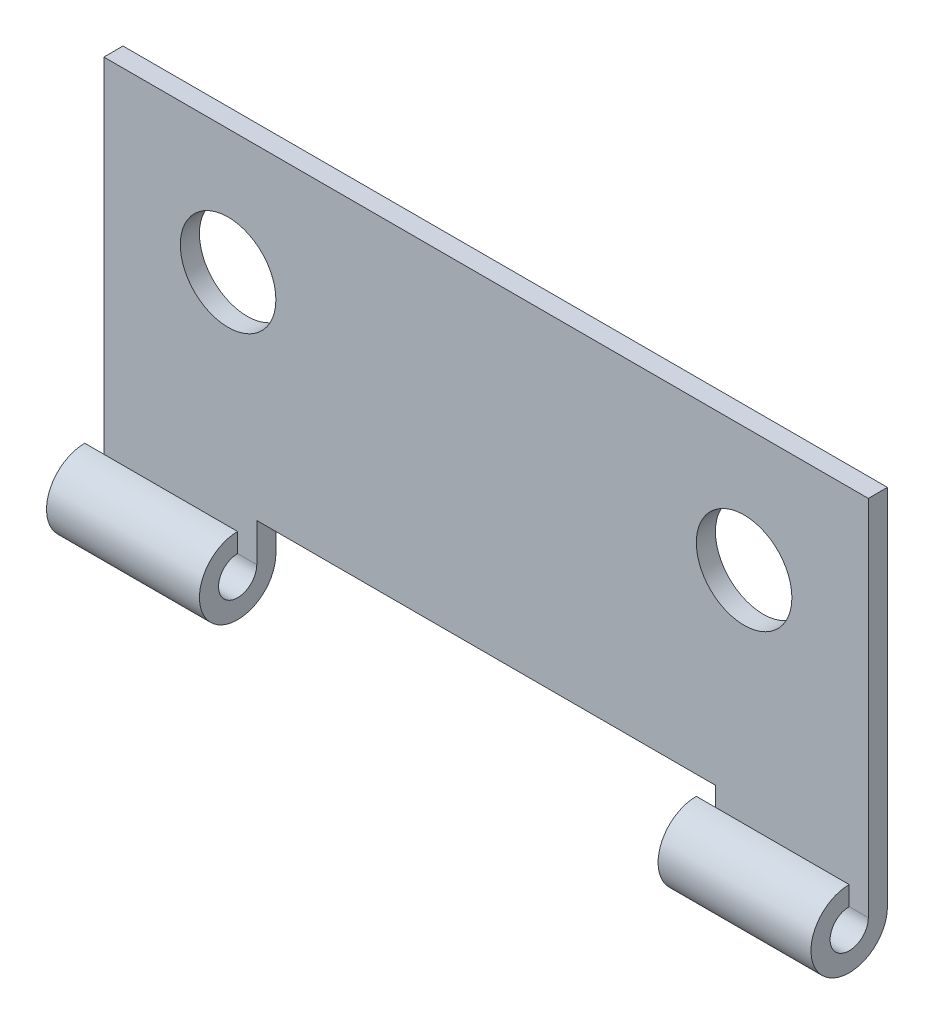
ISO-10303-21;
HEADER;
FILE_DESCRIPTION(('STEP AP214'),'2;1');
FILE_NAME('part.step','',(''),(''),'','','');
FILE_SCHEMA(('AUTOMOTIVE_DESIGN { 1 0 10303 214 1 1 1 1 }'));
ENDSEC;
DATA;
#1=APPLICATION_CONTEXT('core data for automotive mechanical design processes');
#2=APPLICATION_PROTOCOL_DEFINITION('international standard','automotive_design',2000,#1);
#3=PRODUCT_CONTEXT('',#1,'mechanical');
#4=PRODUCT('Part','Part','',(#3));
#5=PRODUCT_RELATED_PRODUCT_CATEGORY('part','',(#4));
#6=PRODUCT_DEFINITION_FORMATION('','',#4);
#7=PRODUCT_DEFINITION_CONTEXT('part definition',#1,'design');
#8=PRODUCT_DEFINITION('design','',#6,#7);
#9=PRODUCT_DEFINITION_SHAPE('','',#8);
#10=(LENGTH_UNIT() NAMED_UNIT(*) SI_UNIT(.MILLI.,.METRE.));
#11=(NAMED_UNIT(*) PLANE_ANGLE_UNIT() SI_UNIT($,.RADIAN.));
#12=(NAMED_UNIT(*) SI_UNIT($,.STERADIAN.) SOLID_ANGLE_UNIT());
#13=UNCERTAINTY_MEASURE_WITH_UNIT(LENGTH_MEASURE(1.E-05),#10,'distance_accuracy_value','');
#14=(GEOMETRIC_REPRESENTATION_CONTEXT(3) GLOBAL_UNCERTAINTY_ASSIGNED_CONTEXT((#13)) GLOBAL_UNIT_ASSIGNED_CONTEXT((#10,
#11,#12)) REPRESENTATION_CONTEXT('',''));
#15=CARTESIAN_POINT('',(0.,0.,0.));
#16=DIRECTION('',(0.,0.,1.));
#17=DIRECTION('',(1.,0.,0.));
#18=AXIS2_PLACEMENT_3D('',#15,#16,#17);
#19=CARTESIAN_POINT('',(0.,0.,1.));
#20=DIRECTION('',(1.,0.,0.));
#21=DIRECTION('',(0.,0.,-1.));
#22=AXIS2_PLACEMENT_3D('',#19,#20,#21);
#23=PLANE('',#22);
#24=DIRECTION('',(0.,-1.,0.));
#25=VECTOR('',#24,1.);
#26=CARTESIAN_POINT('',(0.,0.,0.));
#27=LINE('',#26,#25);
#28=CARTESIAN_POINT('',(0.,17.,0.));
#29=VERTEX_POINT('',#28);
#30=CARTESIAN_POINT('',(0.,-2.,0.));
#31=VERTEX_POINT('',#30);
#32=EDGE_CURVE('E203',#29,#31,#27,.T.);
#33=ORIENTED_EDGE('',*,*,#32,.T.);
#34=CARTESIAN_POINT('',(0.,-2.,2.));
#35=DIRECTION('',(-1.,0.,0.));
#36=DIRECTION('',(0.,0.,1.));
#37=AXIS2_PLACEMENT_3D('',#34,#35,#36);
#38=CIRCLE('',#37,2.);
#39=CARTESIAN_POINT('',(0.,0.,2.));
#40=VERTEX_POINT('',#39);
#41=EDGE_CURVE('E168',#31,#40,#38,.T.);
#42=ORIENTED_EDGE('',*,*,#41,.T.);
#43=DIRECTION('',(0.,-1.,0.));
#44=VECTOR('',#43,1.);
#45=CARTESIAN_POINT('',(0.,0.,2.));
#46=LINE('',#45,#44);
#47=CARTESIAN_POINT('',(0.,-1.,2.));
#48=VERTEX_POINT('',#47);
#49=EDGE_CURVE('E170',#40,#48,#46,.T.);
#50=ORIENTED_EDGE('',*,*,#49,.T.);
#51=CARTESIAN_POINT('',(0.,-2.,2.));
#52=DIRECTION('',(1.,0.,0.));
#53=DIRECTION('',(0.,0.,-1.));
#54=AXIS2_PLACEMENT_3D('',#51,#52,#53);
#55=CIRCLE('',#54,1.);
#56=CARTESIAN_POINT('',(0.,-2.,1.));
#57=VERTEX_POINT('',#56);
#58=EDGE_CURVE('E173',#48,#57,#55,.T.);
#59=ORIENTED_EDGE('',*,*,#58,.T.);
#60=DIRECTION('',(0.,-1.,0.));
#61=VECTOR('',#60,1.);
#62=CARTESIAN_POINT('',(0.,0.,1.));
#63=LINE('',#62,#61);
#64=CARTESIAN_POINT('',(0.,17.,1.));
#65=VERTEX_POINT('',#64);
#66=EDGE_CURVE('E212',#65,#57,#63,.T.);
#67=ORIENTED_EDGE('',*,*,#66,.F.);
#68=DIRECTION('',(0.,0.,-1.));
#69=VECTOR('',#68,1.);
#70=CARTESIAN_POINT('',(0.,17.,1.));
#71=LINE('',#70,#69);
#72=EDGE_CURVE('E40',#65,#29,#71,.T.);
#73=ORIENTED_EDGE('',*,*,#72,.T.);
#74=EDGE_LOOP('',(#33,#42,#50,#59,#67,#73));
#75=FACE_BOUND('',#74,.T.);
#76=ADVANCED_FACE('F33',(#75),#23,.F.);
#77=CARTESIAN_POINT('',(0.,0.,1.));
#78=DIRECTION('',(0.,1.,0.));
#79=DIRECTION('',(0.,0.,1.));
#80=AXIS2_PLACEMENT_3D('',#77,#78,#79);
#81=PLANE('',#80);
#82=DIRECTION('',(1.,0.,0.));
#83=VECTOR('',#82,1.);
#84=CARTESIAN_POINT('',(0.,0.,0.));
#85=LINE('',#84,#83);
#86=CARTESIAN_POINT('',(8.,0.,0.));
#87=VERTEX_POINT('',#86);
#88=CARTESIAN_POINT('',(32.,0.,0.));
#89=VERTEX_POINT('',#88);
#90=EDGE_CURVE('E52',#87,#89,#85,.T.);
#91=ORIENTED_EDGE('',*,*,#90,.T.);
#92=DIRECTION('',(0.,0.,-1.));
#93=VECTOR('',#92,1.);
#94=CARTESIAN_POINT('',(32.,0.,0.));
#95=LINE('',#94,#93);
#96=CARTESIAN_POINT('',(32.,0.,1.));
#97=VERTEX_POINT('',#96);
#98=EDGE_CURVE('E47',#97,#89,#95,.T.);
#99=ORIENTED_EDGE('',*,*,#98,.F.);
#100=DIRECTION('',(1.,0.,0.));
#101=VECTOR('',#100,1.);
#102=CARTESIAN_POINT('',(0.,0.,1.));
#103=LINE('',#102,#101);
#104=CARTESIAN_POINT('',(8.,0.,1.));
#105=VERTEX_POINT('',#104);
#106=EDGE_CURVE('E129',#105,#97,#103,.T.);
#107=ORIENTED_EDGE('',*,*,#106,.F.);
#108=DIRECTION('',(0.,0.,-1.));
#109=VECTOR('',#108,1.);
#110=CARTESIAN_POINT('',(8.,0.,0.));
#111=LINE('',#110,#109);
#112=EDGE_CURVE('E139',#105,#87,#111,.T.);
#113=ORIENTED_EDGE('',*,*,#112,.T.);
#114=EDGE_LOOP('',(#91,#99,#107,#113));
#115=FACE_BOUND('',#114,.T.);
#116=ADVANCED_FACE('F251',(#115),#81,.F.);
#117=CARTESIAN_POINT('',(40.,0.,1.));
#118=DIRECTION('',(-1.,0.,0.));
#119=DIRECTION('',(0.,0.,1.));
#120=AXIS2_PLACEMENT_3D('',#117,#118,#119);
#121=PLANE('',#120);
#122=DIRECTION('',(0.,1.,0.));
#123=VECTOR('',#122,1.);
#124=CARTESIAN_POINT('',(40.,0.,0.));
#125=LINE('',#124,#123);
#126=CARTESIAN_POINT('',(40.,-2.,0.));
#127=VERTEX_POINT('',#126);
#128=CARTESIAN_POINT('',(40.,17.,0.));
#129=VERTEX_POINT('',#128);
#130=EDGE_CURVE('E219',#127,#129,#125,.T.);
#131=ORIENTED_EDGE('',*,*,#130,.T.);
#132=DIRECTION('',(0.,0.,-1.));
#133=VECTOR('',#132,1.);
#134=CARTESIAN_POINT('',(40.,17.,1.));
#135=LINE('',#134,#133);
#136=CARTESIAN_POINT('',(40.,17.,1.));
#137=VERTEX_POINT('',#136);
#138=EDGE_CURVE('E11',#137,#129,#135,.T.);
#139=ORIENTED_EDGE('',*,*,#138,.F.);
#140=DIRECTION('',(0.,1.,0.));
#141=VECTOR('',#140,1.);
#142=CARTESIAN_POINT('',(40.,0.,1.));
#143=LINE('',#142,#141);
#144=CARTESIAN_POINT('',(40.,-2.,1.));
#145=VERTEX_POINT('',#144);
#146=EDGE_CURVE('E119',#145,#137,#143,.T.);
#147=ORIENTED_EDGE('',*,*,#146,.F.);
#148=CARTESIAN_POINT('',(40.,-2.,2.));
#149=DIRECTION('',(1.,0.,0.));
#150=DIRECTION('',(0.,0.,-1.));
#151=AXIS2_PLACEMENT_3D('',#148,#149,#150);
#152=CIRCLE('',#151,1.);
#153=CARTESIAN_POINT('',(40.,-1.,2.));
#154=VERTEX_POINT('',#153);
#155=EDGE_CURVE('E124',#154,#145,#152,.T.);
#156=ORIENTED_EDGE('',*,*,#155,.F.);
#157=DIRECTION('',(0.,-1.,0.));
#158=VECTOR('',#157,1.);
#159=CARTESIAN_POINT('',(40.,0.,2.));
#160=LINE('',#159,#158);
#161=CARTESIAN_POINT('',(40.,0.,2.));
#162=VERTEX_POINT('',#161);
#163=EDGE_CURVE('E143',#162,#154,#160,.T.);
#164=ORIENTED_EDGE('',*,*,#163,.F.);
#165=CARTESIAN_POINT('',(40.,-2.,2.));
#166=DIRECTION('',(-1.,0.,0.));
#167=DIRECTION('',(0.,0.,1.));
#168=AXIS2_PLACEMENT_3D('',#165,#166,#167);
#169=CIRCLE('',#168,2.);
#170=EDGE_CURVE('E146',#127,#162,#169,.T.);
#171=ORIENTED_EDGE('',*,*,#170,.F.);
#172=EDGE_LOOP('',(#131,#139,#147,#156,#164,#171));
#173=FACE_BOUND('',#172,.T.);
#174=ADVANCED_FACE('F121',(#173),#121,.F.);
#175=CARTESIAN_POINT('',(0.,17.,1.));
#176=DIRECTION('',(0.,-1.,0.));
#177=DIRECTION('',(0.,0.,-1.));
#178=AXIS2_PLACEMENT_3D('',#175,#176,#177);
#179=PLANE('',#178);
#180=DIRECTION('',(-1.,0.,0.));
#181=VECTOR('',#180,1.);
#182=CARTESIAN_POINT('',(0.,17.,0.));
#183=LINE('',#182,#181);
#184=EDGE_CURVE('E214',#129,#29,#183,.T.);
#185=ORIENTED_EDGE('',*,*,#184,.T.);
#186=ORIENTED_EDGE('',*,*,#72,.F.);
#187=DIRECTION('',(-1.,0.,0.));
#188=VECTOR('',#187,1.);
#189=CARTESIAN_POINT('',(0.,17.,1.));
#190=LINE('',#189,#188);
#191=EDGE_CURVE('E128',#137,#65,#190,.T.);
#192=ORIENTED_EDGE('',*,*,#191,.F.);
#193=ORIENTED_EDGE('',*,*,#138,.T.);
#194=EDGE_LOOP('',(#185,#186,#192,#193));
#195=FACE_BOUND('',#194,.T.);
#196=ADVANCED_FACE('F263',(#195),#179,.F.);
#197=CARTESIAN_POINT('',(0.,0.,1.));
#198=DIRECTION('',(0.,0.,-1.));
#199=DIRECTION('',(-1.,0.,0.));
#200=AXIS2_PLACEMENT_3D('',#197,#198,#199);
#201=PLANE('',#200);
#202=CARTESIAN_POINT('',(6.5,10.5,1.));
#203=DIRECTION('',(0.,0.,1.));
#204=DIRECTION('',(1.,0.,0.));
#205=AXIS2_PLACEMENT_3D('',#202,#203,#204);
#206=CIRCLE('',#205,2.5);
#207=CARTESIAN_POINT('',(9.,10.5,1.));
#208=VERTEX_POINT('',#207);
#209=EDGE_CURVE('E200',#208,#208,#206,.T.);
#210=ORIENTED_EDGE('',*,*,#209,.F.);
#211=EDGE_LOOP('',(#210));
#212=FACE_BOUND('',#211,.T.);
#213=CARTESIAN_POINT('',(33.5,10.5,1.));
#214=DIRECTION('',(0.,0.,1.));
#215=DIRECTION('',(1.,0.,0.));
#216=AXIS2_PLACEMENT_3D('',#213,#214,#215);
#217=CIRCLE('',#216,2.5);
#218=CARTESIAN_POINT('',(36.,10.5,1.));
#219=VERTEX_POINT('',#218);
#220=EDGE_CURVE('E207',#219,#219,#217,.T.);
#221=ORIENTED_EDGE('',*,*,#220,.F.);
#222=EDGE_LOOP('',(#221));
#223=FACE_BOUND('',#222,.T.);
#224=ORIENTED_EDGE('',*,*,#66,.T.);
#225=DIRECTION('',(1.,0.,0.));
#226=VECTOR('',#225,1.);
#227=CARTESIAN_POINT('',(0.,-2.,1.));
#228=LINE('',#227,#226);
#229=CARTESIAN_POINT('',(8.,-2.,1.));
#230=VERTEX_POINT('',#229);
#231=EDGE_CURVE('E176',#57,#230,#228,.T.);
#232=ORIENTED_EDGE('',*,*,#231,.T.);
#233=DIRECTION('',(0.,1.,0.));
#234=VECTOR('',#233,1.);
#235=CARTESIAN_POINT('',(8.,-2.,1.));
#236=LINE('',#235,#234);
#237=EDGE_CURVE('E171',#230,#105,#236,.T.);
#238=ORIENTED_EDGE('',*,*,#237,.T.);
#239=ORIENTED_EDGE('',*,*,#106,.T.);
#240=DIRECTION('',(0.,1.,0.));
#241=VECTOR('',#240,1.);
#242=CARTESIAN_POINT('',(32.,-2.,1.));
#243=LINE('',#242,#241);
#244=CARTESIAN_POINT('',(32.,-2.,1.));
#245=VERTEX_POINT('',#244);
#246=EDGE_CURVE('E135',#245,#97,#243,.T.);
#247=ORIENTED_EDGE('',*,*,#246,.F.);
#248=DIRECTION('',(-1.,0.,0.));
#249=VECTOR('',#248,1.);
#250=CARTESIAN_POINT('',(40.,-2.,1.));
#251=LINE('',#250,#249);
#252=EDGE_CURVE('E132',#145,#245,#251,.T.);
#253=ORIENTED_EDGE('',*,*,#252,.F.);
#254=ORIENTED_EDGE('',*,*,#146,.T.);
#255=ORIENTED_EDGE('',*,*,#191,.T.);
#256=EDGE_LOOP('',(#224,#232,#238,#239,#247,#253,#254,#255));
#257=FACE_BOUND('',#256,.T.);
#258=ADVANCED_FACE('F133',(#212,#223,#257),#201,.F.);
#259=CARTESIAN_POINT('',(0.,0.,0.));
#260=DIRECTION('',(0.,0.,-1.));
#261=DIRECTION('',(-1.,0.,0.));
#262=AXIS2_PLACEMENT_3D('',#259,#260,#261);
#263=PLANE('',#262);
#264=CARTESIAN_POINT('',(6.5,10.5,0.));
#265=DIRECTION('',(0.,0.,-1.));
#266=DIRECTION('',(-1.,0.,0.));
#267=AXIS2_PLACEMENT_3D('',#264,#265,#266);
#268=CIRCLE('',#267,2.5);
#269=CARTESIAN_POINT('',(4.,10.5,0.));
#270=VERTEX_POINT('',#269);
#271=EDGE_CURVE('E204',#270,#270,#268,.F.);
#272=ORIENTED_EDGE('',*,*,#271,.T.);
#273=EDGE_LOOP('',(#272));
#274=FACE_BOUND('',#273,.T.);
#275=CARTESIAN_POINT('',(33.5,10.5,0.));
#276=DIRECTION('',(0.,0.,-1.));
#277=DIRECTION('',(-1.,0.,0.));
#278=AXIS2_PLACEMENT_3D('',#275,#276,#277);
#279=CIRCLE('',#278,2.5);
#280=CARTESIAN_POINT('',(31.,10.5,0.));
#281=VERTEX_POINT('',#280);
#282=EDGE_CURVE('E199',#281,#281,#279,.F.);
#283=ORIENTED_EDGE('',*,*,#282,.T.);
#284=EDGE_LOOP('',(#283));
#285=FACE_BOUND('',#284,.T.);
#286=ORIENTED_EDGE('',*,*,#32,.F.);
#287=ORIENTED_EDGE('',*,*,#184,.F.);
#288=ORIENTED_EDGE('',*,*,#130,.F.);
#289=DIRECTION('',(-1.,0.,0.));
#290=VECTOR('',#289,1.);
#291=CARTESIAN_POINT('',(40.,-2.,0.));
#292=LINE('',#291,#290);
#293=CARTESIAN_POINT('',(32.,-2.,0.));
#294=VERTEX_POINT('',#293);
#295=EDGE_CURVE('E154',#127,#294,#292,.T.);
#296=ORIENTED_EDGE('',*,*,#295,.T.);
#297=DIRECTION('',(0.,-1.,0.));
#298=VECTOR('',#297,1.);
#299=CARTESIAN_POINT('',(32.,0.,0.));
#300=LINE('',#299,#298);
#301=EDGE_CURVE('E144',#89,#294,#300,.T.);
#302=ORIENTED_EDGE('',*,*,#301,.F.);
#303=ORIENTED_EDGE('',*,*,#90,.F.);
#304=DIRECTION('',(0.,-1.,0.));
#305=VECTOR('',#304,1.);
#306=CARTESIAN_POINT('',(8.,0.,0.));
#307=LINE('',#306,#305);
#308=CARTESIAN_POINT('',(8.,-2.,0.));
#309=VERTEX_POINT('',#308);
#310=EDGE_CURVE('E178',#87,#309,#307,.T.);
#311=ORIENTED_EDGE('',*,*,#310,.T.);
#312=DIRECTION('',(1.,0.,0.));
#313=VECTOR('',#312,1.);
#314=CARTESIAN_POINT('',(0.,-2.,0.));
#315=LINE('',#314,#313);
#316=EDGE_CURVE('E196',#31,#309,#315,.T.);
#317=ORIENTED_EDGE('',*,*,#316,.F.);
#318=EDGE_LOOP('',(#286,#287,#288,#296,#302,#303,#311,#317));
#319=FACE_BOUND('',#318,.T.);
#320=ADVANCED_FACE('F230',(#274,#285,#319),#263,.T.);
#321=CARTESIAN_POINT('',(33.5,10.5,-0.000999999999999916));
#322=DIRECTION('',(0.,0.,1.));
#323=DIRECTION('',(1.,0.,0.));
#324=AXIS2_PLACEMENT_3D('',#321,#322,#323);
#325=CYLINDRICAL_SURFACE('',#324,2.5);
#326=ORIENTED_EDGE('',*,*,#282,.F.);
#327=EDGE_LOOP('',(#326));
#328=FACE_BOUND('',#327,.T.);
#329=ORIENTED_EDGE('',*,*,#220,.T.);
#330=EDGE_LOOP('',(#329));
#331=FACE_BOUND('',#330,.T.);
#332=ADVANCED_FACE('F303',(#328,#331),#325,.F.);
#333=CARTESIAN_POINT('',(6.5,10.5,-0.000999999999999916));
#334=DIRECTION('',(0.,0.,1.));
#335=DIRECTION('',(1.,0.,0.));
#336=AXIS2_PLACEMENT_3D('',#333,#334,#335);
#337=CYLINDRICAL_SURFACE('',#336,2.5);
#338=ORIENTED_EDGE('',*,*,#271,.F.);
#339=EDGE_LOOP('',(#338));
#340=FACE_BOUND('',#339,.T.);
#341=ORIENTED_EDGE('',*,*,#209,.T.);
#342=EDGE_LOOP('',(#341));
#343=FACE_BOUND('',#342,.T.);
#344=ADVANCED_FACE('F350',(#340,#343),#337,.F.);
#345=CARTESIAN_POINT('',(0.,-2.,2.));
#346=DIRECTION('',(1.,0.,0.));
#347=DIRECTION('',(0.,0.,-1.));
#348=AXIS2_PLACEMENT_3D('',#345,#346,#347);
#349=CYLINDRICAL_SURFACE('',#348,2.);
#350=CARTESIAN_POINT('',(8.,-2.,2.));
#351=DIRECTION('',(-1.,0.,0.));
#352=DIRECTION('',(0.,0.,1.));
#353=AXIS2_PLACEMENT_3D('',#350,#351,#352);
#354=CIRCLE('',#353,2.);
#355=CARTESIAN_POINT('',(8.,0.,2.));
#356=VERTEX_POINT('',#355);
#357=EDGE_CURVE('E180',#309,#356,#354,.T.);
#358=ORIENTED_EDGE('',*,*,#357,.T.);
#359=DIRECTION('',(1.,0.,0.));
#360=VECTOR('',#359,1.);
#361=CARTESIAN_POINT('',(0.,0.,2.));
#362=LINE('',#361,#360);
#363=EDGE_CURVE('E193',#40,#356,#362,.T.);
#364=ORIENTED_EDGE('',*,*,#363,.F.);
#365=ORIENTED_EDGE('',*,*,#41,.F.);
#366=ORIENTED_EDGE('',*,*,#316,.T.);
#367=EDGE_LOOP('',(#358,#364,#365,#366));
#368=FACE_BOUND('',#367,.T.);
#369=ADVANCED_FACE('F236',(#368),#349,.T.);
#370=CARTESIAN_POINT('',(0.,0.,2.));
#371=DIRECTION('',(0.,0.,1.));
#372=DIRECTION('',(0.,-1.,0.));
#373=AXIS2_PLACEMENT_3D('',#370,#371,#372);
#374=PLANE('',#373);
#375=DIRECTION('',(0.,-1.,0.));
#376=VECTOR('',#375,1.);
#377=CARTESIAN_POINT('',(8.,0.,2.));
#378=LINE('',#377,#376);
#379=CARTESIAN_POINT('',(8.,-1.,2.));
#380=VERTEX_POINT('',#379);
#381=EDGE_CURVE('E182',#356,#380,#378,.T.);
#382=ORIENTED_EDGE('',*,*,#381,.T.);
#383=DIRECTION('',(1.,0.,0.));
#384=VECTOR('',#383,1.);
#385=CARTESIAN_POINT('',(0.,-1.,2.));
#386=LINE('',#385,#384);
#387=EDGE_CURVE('E190',#48,#380,#386,.T.);
#388=ORIENTED_EDGE('',*,*,#387,.F.);
#389=ORIENTED_EDGE('',*,*,#49,.F.);
#390=ORIENTED_EDGE('',*,*,#363,.T.);
#391=EDGE_LOOP('',(#382,#388,#389,#390));
#392=FACE_BOUND('',#391,.T.);
#393=ADVANCED_FACE('F242',(#392),#374,.F.);
#394=CARTESIAN_POINT('',(0.,-2.,2.));
#395=DIRECTION('',(1.,0.,0.));
#396=DIRECTION('',(0.,0.,-1.));
#397=AXIS2_PLACEMENT_3D('',#394,#395,#396);
#398=CYLINDRICAL_SURFACE('',#397,1.);
#399=CARTESIAN_POINT('',(8.,-2.,2.));
#400=DIRECTION('',(1.,0.,0.));
#401=DIRECTION('',(0.,0.,-1.));
#402=AXIS2_PLACEMENT_3D('',#399,#400,#401);
#403=CIRCLE('',#402,1.);
#404=EDGE_CURVE('E184',#380,#230,#403,.T.);
#405=ORIENTED_EDGE('',*,*,#404,.T.);
#406=ORIENTED_EDGE('',*,*,#231,.F.);
#407=ORIENTED_EDGE('',*,*,#58,.F.);
#408=ORIENTED_EDGE('',*,*,#387,.T.);
#409=EDGE_LOOP('',(#405,#406,#407,#408));
#410=FACE_BOUND('',#409,.T.);
#411=ADVANCED_FACE('F246',(#410),#398,.F.);
#412=CARTESIAN_POINT('',(8.,-2.,2.));
#413=DIRECTION('',(1.,0.,0.));
#414=DIRECTION('',(0.,0.,-1.));
#415=AXIS2_PLACEMENT_3D('',#412,#413,#414);
#416=PLANE('',#415);
#417=ORIENTED_EDGE('',*,*,#112,.F.);
#418=ORIENTED_EDGE('',*,*,#237,.F.);
#419=ORIENTED_EDGE('',*,*,#404,.F.);
#420=ORIENTED_EDGE('',*,*,#381,.F.);
#421=ORIENTED_EDGE('',*,*,#357,.F.);
#422=ORIENTED_EDGE('',*,*,#310,.F.);
#423=EDGE_LOOP('',(#417,#418,#419,#420,#421,#422));
#424=FACE_BOUND('',#423,.T.);
#425=ADVANCED_FACE('F250',(#424),#416,.T.);
#426=CARTESIAN_POINT('',(40.,-2.,2.));
#427=DIRECTION('',(-1.,0.,0.));
#428=DIRECTION('',(0.,0.,1.));
#429=AXIS2_PLACEMENT_3D('',#426,#427,#428);
#430=CYLINDRICAL_SURFACE('',#429,1.);
#431=CARTESIAN_POINT('',(32.,-2.,2.));
#432=DIRECTION('',(1.,0.,0.));
#433=DIRECTION('',(0.,0.,-1.));
#434=AXIS2_PLACEMENT_3D('',#431,#432,#433);
#435=CIRCLE('',#434,1.);
#436=CARTESIAN_POINT('',(32.,-1.,2.));
#437=VERTEX_POINT('',#436);
#438=EDGE_CURVE('E157',#437,#245,#435,.T.);
#439=ORIENTED_EDGE('',*,*,#438,.F.);
#440=DIRECTION('',(-1.,0.,0.));
#441=VECTOR('',#440,1.);
#442=CARTESIAN_POINT('',(40.,-1.,2.));
#443=LINE('',#442,#441);
#444=EDGE_CURVE('E140',#154,#437,#443,.T.);
#445=ORIENTED_EDGE('',*,*,#444,.F.);
#446=ORIENTED_EDGE('',*,*,#155,.T.);
#447=ORIENTED_EDGE('',*,*,#252,.T.);
#448=EDGE_LOOP('',(#439,#445,#446,#447));
#449=FACE_BOUND('',#448,.T.);
#450=ADVANCED_FACE('F142',(#449),#430,.F.);
#451=CARTESIAN_POINT('',(40.,0.,2.));
#452=DIRECTION('',(0.,0.,-1.));
#453=DIRECTION('',(0.,1.,0.));
#454=AXIS2_PLACEMENT_3D('',#451,#452,#453);
#455=PLANE('',#454);
#456=DIRECTION('',(0.,-1.,0.));
#457=VECTOR('',#456,1.);
#458=CARTESIAN_POINT('',(32.,0.,2.));
#459=LINE('',#458,#457);
#460=CARTESIAN_POINT('',(32.,0.,2.));
#461=VERTEX_POINT('',#460);
#462=EDGE_CURVE('E159',#461,#437,#459,.T.);
#463=ORIENTED_EDGE('',*,*,#462,.F.);
#464=DIRECTION('',(-1.,0.,0.));
#465=VECTOR('',#464,1.);
#466=CARTESIAN_POINT('',(40.,0.,2.));
#467=LINE('',#466,#465);
#468=EDGE_CURVE('E165',#162,#461,#467,.T.);
#469=ORIENTED_EDGE('',*,*,#468,.F.);
#470=ORIENTED_EDGE('',*,*,#163,.T.);
#471=ORIENTED_EDGE('',*,*,#444,.T.);
#472=EDGE_LOOP('',(#463,#469,#470,#471));
#473=FACE_BOUND('',#472,.T.);
#474=ADVANCED_FACE('F258',(#473),#455,.T.);
#475=CARTESIAN_POINT('',(40.,-2.,2.));
#476=DIRECTION('',(-1.,0.,0.));
#477=DIRECTION('',(0.,0.,1.));
#478=AXIS2_PLACEMENT_3D('',#475,#476,#477);
#479=CYLINDRICAL_SURFACE('',#478,2.);
#480=CARTESIAN_POINT('',(32.,-2.,2.));
#481=DIRECTION('',(-1.,0.,0.));
#482=DIRECTION('',(0.,0.,1.));
#483=AXIS2_PLACEMENT_3D('',#480,#481,#482);
#484=CIRCLE('',#483,2.);
#485=EDGE_CURVE('E149',#294,#461,#484,.T.);
#486=ORIENTED_EDGE('',*,*,#485,.F.);
#487=ORIENTED_EDGE('',*,*,#295,.F.);
#488=ORIENTED_EDGE('',*,*,#170,.T.);
#489=ORIENTED_EDGE('',*,*,#468,.T.);
#490=EDGE_LOOP('',(#486,#487,#488,#489));
#491=FACE_BOUND('',#490,.T.);
#492=ADVANCED_FACE('F262',(#491),#479,.T.);
#493=CARTESIAN_POINT('',(32.,-2.,2.));
#494=DIRECTION('',(-1.,0.,0.));
#495=DIRECTION('',(0.,0.,-1.));
#496=AXIS2_PLACEMENT_3D('',#493,#494,#495);
#497=PLANE('',#496);
#498=ORIENTED_EDGE('',*,*,#98,.T.);
#499=ORIENTED_EDGE('',*,*,#301,.T.);
#500=ORIENTED_EDGE('',*,*,#485,.T.);
#501=ORIENTED_EDGE('',*,*,#462,.T.);
#502=ORIENTED_EDGE('',*,*,#438,.T.);
#503=ORIENTED_EDGE('',*,*,#246,.T.);
#504=EDGE_LOOP('',(#498,#499,#500,#501,#502,#503));
#505=FACE_BOUND('',#504,.T.);
#506=ADVANCED_FACE('F253',(#505),#497,.T.);
#507=CLOSED_SHELL('',(#76,#116,#174,#196,#258,#320,#332,#344,#369,#393,#411,#425,#450,#474,#492,#506));
#508=MANIFOLD_SOLID_BREP('B2',#507);
#509=ADVANCED_BREP_SHAPE_REPRESENTATION('',(#18,#508),#14);
#510=SHAPE_DEFINITION_REPRESENTATION(#9,#509);
ENDSEC;
END-ISO-10303-21;
